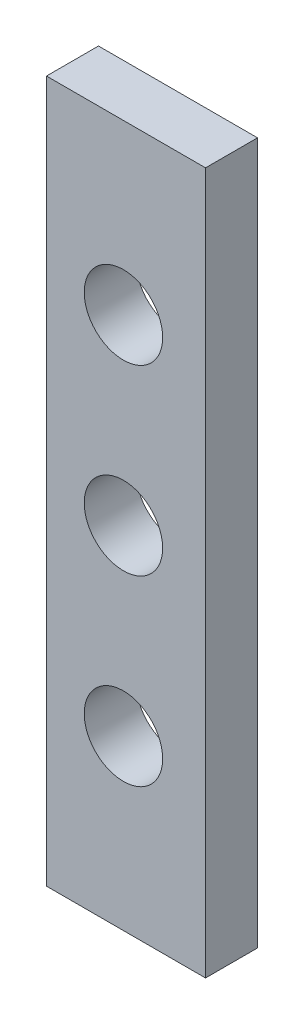
ISO-10303-21;
HEADER;
FILE_DESCRIPTION(('STEP AP214'),'2;1');
FILE_NAME('part.step','',(''),(''),'','','');
FILE_SCHEMA(('AUTOMOTIVE_DESIGN { 1 0 10303 214 1 1 1 1 }'));
ENDSEC;
DATA;
#1=APPLICATION_CONTEXT('core data for automotive mechanical design processes');
#2=APPLICATION_PROTOCOL_DEFINITION('international standard','automotive_design',2000,#1);
#3=PRODUCT_CONTEXT('',#1,'mechanical');
#4=PRODUCT('Part','Part','',(#3));
#5=PRODUCT_RELATED_PRODUCT_CATEGORY('part','',(#4));
#6=PRODUCT_DEFINITION_FORMATION('','',#4);
#7=PRODUCT_DEFINITION_CONTEXT('part definition',#1,'design');
#8=PRODUCT_DEFINITION('design','',#6,#7);
#9=PRODUCT_DEFINITION_SHAPE('','',#8);
#10=(LENGTH_UNIT() NAMED_UNIT(*) SI_UNIT(.MILLI.,.METRE.));
#11=(NAMED_UNIT(*) PLANE_ANGLE_UNIT() SI_UNIT($,.RADIAN.));
#12=(NAMED_UNIT(*) SI_UNIT($,.STERADIAN.) SOLID_ANGLE_UNIT());
#13=UNCERTAINTY_MEASURE_WITH_UNIT(LENGTH_MEASURE(1.E-05),#10,'distance_accuracy_value','');
#14=(GEOMETRIC_REPRESENTATION_CONTEXT(3) GLOBAL_UNCERTAINTY_ASSIGNED_CONTEXT((#13)) GLOBAL_UNIT_ASSIGNED_CONTEXT((#10,
#11,#12)) REPRESENTATION_CONTEXT('',''));
#15=CARTESIAN_POINT('',(0.,0.,0.));
#16=DIRECTION('',(0.,0.,1.));
#17=DIRECTION('',(1.,0.,0.));
#18=AXIS2_PLACEMENT_3D('',#15,#16,#17);
#19=CARTESIAN_POINT('',(-130.,-105.,42.4383510177094));
#20=DIRECTION('',(1.,0.,0.));
#21=DIRECTION('',(0.,0.,-1.));
#22=AXIS2_PLACEMENT_3D('',#19,#20,#21);
#23=PLANE('',#22);
#24=DIRECTION('',(0.,-1.,0.));
#25=VECTOR('',#24,1.);
#26=CARTESIAN_POINT('',(-130.,-105.,2.85000000128499));
#27=LINE('',#26,#25);
#28=CARTESIAN_POINT('',(-130.,-66.5373864405591,2.85000000128499));
#29=VERTEX_POINT('',#28);
#30=CARTESIAN_POINT('',(-130.,-105.,2.85000000128499));
#31=VERTEX_POINT('',#30);
#32=EDGE_CURVE('E89',#29,#31,#27,.T.);
#33=ORIENTED_EDGE('',*,*,#32,.F.);
#34=DIRECTION('',(0.,0.,-1.));
#35=VECTOR('',#34,1.);
#36=CARTESIAN_POINT('',(-130.,-66.5373864405591,42.4383510177094));
#37=LINE('',#36,#35);
#38=CARTESIAN_POINT('',(-130.,-66.5373864405591,0.));
#39=VERTEX_POINT('',#38);
#40=EDGE_CURVE('E55',#29,#39,#37,.T.);
#41=ORIENTED_EDGE('',*,*,#40,.T.);
#42=DIRECTION('',(0.,-1.,0.));
#43=VECTOR('',#42,1.);
#44=CARTESIAN_POINT('',(-130.,-105.,0.));
#45=LINE('',#44,#43);
#46=CARTESIAN_POINT('',(-130.,-105.,0.));
#47=VERTEX_POINT('',#46);
#48=EDGE_CURVE('E87',#39,#47,#45,.T.);
#49=ORIENTED_EDGE('',*,*,#48,.T.);
#50=DIRECTION('',(0.,0.,-1.));
#51=VECTOR('',#50,1.);
#52=CARTESIAN_POINT('',(-130.,-105.,42.4383510177094));
#53=LINE('',#52,#51);
#54=EDGE_CURVE('E78',#31,#47,#53,.T.);
#55=ORIENTED_EDGE('',*,*,#54,.F.);
#56=EDGE_LOOP('',(#33,#41,#49,#55));
#57=FACE_BOUND('',#56,.T.);
#58=ADVANCED_FACE('F38',(#57),#23,.F.);
#59=CARTESIAN_POINT('',(-130.,-105.,42.4383510177094));
#60=DIRECTION('',(0.,1.,0.));
#61=DIRECTION('',(-1.,0.,0.));
#62=AXIS2_PLACEMENT_3D('',#59,#60,#61);
#63=PLANE('',#62);
#64=DIRECTION('',(1.,0.,0.));
#65=VECTOR('',#64,1.);
#66=CARTESIAN_POINT('',(-130.,-105.,2.85000000128499));
#67=LINE('',#66,#65);
#68=CARTESIAN_POINT('',(-121.281577604188,-105.,2.85000000128499));
#69=VERTEX_POINT('',#68);
#70=EDGE_CURVE('E47',#31,#69,#67,.T.);
#71=ORIENTED_EDGE('',*,*,#70,.F.);
#72=ORIENTED_EDGE('',*,*,#54,.T.);
#73=DIRECTION('',(1.,0.,0.));
#74=VECTOR('',#73,1.);
#75=CARTESIAN_POINT('',(-130.,-105.,0.));
#76=LINE('',#75,#74);
#77=CARTESIAN_POINT('',(-121.281577604188,-105.,0.));
#78=VERTEX_POINT('',#77);
#79=EDGE_CURVE('E101',#47,#78,#76,.T.);
#80=ORIENTED_EDGE('',*,*,#79,.T.);
#81=DIRECTION('',(0.,0.,-1.));
#82=VECTOR('',#81,1.);
#83=CARTESIAN_POINT('',(-121.281577604188,-105.,42.4383510177094));
#84=LINE('',#83,#82);
#85=EDGE_CURVE('E110',#69,#78,#84,.T.);
#86=ORIENTED_EDGE('',*,*,#85,.F.);
#87=EDGE_LOOP('',(#71,#72,#80,#86));
#88=FACE_BOUND('',#87,.T.);
#89=ADVANCED_FACE('F133',(#88),#63,.F.);
#90=CARTESIAN_POINT('',(-121.281577604188,-105.,42.4383510177094));
#91=DIRECTION('',(-1.,0.,0.));
#92=DIRECTION('',(0.,-1.,0.));
#93=AXIS2_PLACEMENT_3D('',#90,#91,#92);
#94=PLANE('',#93);
#95=DIRECTION('',(0.,1.,0.));
#96=VECTOR('',#95,1.);
#97=CARTESIAN_POINT('',(-121.281577604188,-105.,2.85000000128499));
#98=LINE('',#97,#96);
#99=CARTESIAN_POINT('',(-121.281577604188,-66.5373864405591,2.85000000128499));
#100=VERTEX_POINT('',#99);
#101=EDGE_CURVE('E12',#69,#100,#98,.T.);
#102=ORIENTED_EDGE('',*,*,#101,.F.);
#103=ORIENTED_EDGE('',*,*,#85,.T.);
#104=DIRECTION('',(0.,1.,0.));
#105=VECTOR('',#104,1.);
#106=CARTESIAN_POINT('',(-121.281577604188,-105.,0.));
#107=LINE('',#106,#105);
#108=CARTESIAN_POINT('',(-121.281577604188,-66.5373864405591,0.));
#109=VERTEX_POINT('',#108);
#110=EDGE_CURVE('E112',#78,#109,#107,.T.);
#111=ORIENTED_EDGE('',*,*,#110,.T.);
#112=DIRECTION('',(0.,0.,-1.));
#113=VECTOR('',#112,1.);
#114=CARTESIAN_POINT('',(-121.281577604188,-66.5373864405591,42.4383510177094));
#115=LINE('',#114,#113);
#116=EDGE_CURVE('E61',#100,#109,#115,.T.);
#117=ORIENTED_EDGE('',*,*,#116,.F.);
#118=EDGE_LOOP('',(#102,#103,#111,#117));
#119=FACE_BOUND('',#118,.T.);
#120=ADVANCED_FACE('F132',(#119),#94,.F.);
#121=CARTESIAN_POINT('',(-130.,-66.5373864405591,42.4383510177094));
#122=DIRECTION('',(0.,-1.,0.));
#123=DIRECTION('',(0.,0.,-1.));
#124=AXIS2_PLACEMENT_3D('',#121,#122,#123);
#125=PLANE('',#124);
#126=DIRECTION('',(-1.,0.,0.));
#127=VECTOR('',#126,1.);
#128=CARTESIAN_POINT('',(-130.,-66.5373864405591,2.85000000128499));
#129=LINE('',#128,#127);
#130=EDGE_CURVE('E98',#100,#29,#129,.T.);
#131=ORIENTED_EDGE('',*,*,#130,.F.);
#132=ORIENTED_EDGE('',*,*,#116,.T.);
#133=DIRECTION('',(-1.,0.,0.));
#134=VECTOR('',#133,1.);
#135=CARTESIAN_POINT('',(-130.,-66.5373864405591,0.));
#136=LINE('',#135,#134);
#137=EDGE_CURVE('E94',#109,#39,#136,.T.);
#138=ORIENTED_EDGE('',*,*,#137,.T.);
#139=ORIENTED_EDGE('',*,*,#40,.F.);
#140=EDGE_LOOP('',(#131,#132,#138,#139));
#141=FACE_BOUND('',#140,.T.);
#142=ADVANCED_FACE('F95',(#141),#125,.F.);
#143=CARTESIAN_POINT('',(0.,0.,0.));
#144=DIRECTION('',(0.,0.,-1.));
#145=DIRECTION('',(-1.,0.,0.));
#146=AXIS2_PLACEMENT_3D('',#143,#144,#145);
#147=PLANE('',#146);
#148=CARTESIAN_POINT('',(-125.781577604187,-95.7686932202796,0.));
#149=DIRECTION('',(0.,0.,-1.));
#150=DIRECTION('',(-1.,0.,0.));
#151=AXIS2_PLACEMENT_3D('',#148,#149,#150);
#152=CIRCLE('',#151,2.15);
#153=CARTESIAN_POINT('',(-127.931577604187,-95.7686932202796,0.));
#154=VERTEX_POINT('',#153);
#155=EDGE_CURVE('E42',#154,#154,#152,.T.);
#156=ORIENTED_EDGE('',*,*,#155,.F.);
#157=EDGE_LOOP('',(#156));
#158=FACE_BOUND('',#157,.T.);
#159=CARTESIAN_POINT('',(-125.781577604187,-85.7686932202796,0.));
#160=DIRECTION('',(0.,0.,-1.));
#161=DIRECTION('',(-1.,0.,0.));
#162=AXIS2_PLACEMENT_3D('',#159,#160,#161);
#163=CIRCLE('',#162,2.15);
#164=CARTESIAN_POINT('',(-127.931577604187,-85.7686932202796,0.));
#165=VERTEX_POINT('',#164);
#166=EDGE_CURVE('E116',#165,#165,#163,.T.);
#167=ORIENTED_EDGE('',*,*,#166,.F.);
#168=EDGE_LOOP('',(#167));
#169=FACE_BOUND('',#168,.T.);
#170=CARTESIAN_POINT('',(-125.781577604187,-75.7686932202796,0.));
#171=DIRECTION('',(0.,0.,-1.));
#172=DIRECTION('',(-1.,0.,0.));
#173=AXIS2_PLACEMENT_3D('',#170,#171,#172);
#174=CIRCLE('',#173,2.15);
#175=CARTESIAN_POINT('',(-127.931577604187,-75.7686932202796,0.));
#176=VERTEX_POINT('',#175);
#177=EDGE_CURVE('E91',#176,#176,#174,.T.);
#178=ORIENTED_EDGE('',*,*,#177,.F.);
#179=EDGE_LOOP('',(#178));
#180=FACE_BOUND('',#179,.T.);
#181=ORIENTED_EDGE('',*,*,#48,.F.);
#182=ORIENTED_EDGE('',*,*,#137,.F.);
#183=ORIENTED_EDGE('',*,*,#110,.F.);
#184=ORIENTED_EDGE('',*,*,#79,.F.);
#185=EDGE_LOOP('',(#181,#182,#183,#184));
#186=FACE_BOUND('',#185,.T.);
#187=ADVANCED_FACE('F100',(#158,#169,#180,#186),#147,.T.);
#188=CARTESIAN_POINT('',(-98.0000000000002,121.642872631566,2.850000001285));
#189=DIRECTION('',(0.,0.,1.));
#190=DIRECTION('',(1.,0.,0.));
#191=AXIS2_PLACEMENT_3D('',#188,#189,#190);
#192=PLANE('',#191);
#193=CARTESIAN_POINT('',(-125.781577604187,-95.7686932202796,2.85000000128499));
#194=DIRECTION('',(0.,0.,1.));
#195=DIRECTION('',(1.,0.,0.));
#196=AXIS2_PLACEMENT_3D('',#193,#194,#195);
#197=CIRCLE('',#196,2.15);
#198=CARTESIAN_POINT('',(-123.631577604187,-95.7686932202796,2.85000000128499));
#199=VERTEX_POINT('',#198);
#200=EDGE_CURVE('E119',#199,#199,#197,.T.);
#201=ORIENTED_EDGE('',*,*,#200,.F.);
#202=EDGE_LOOP('',(#201));
#203=FACE_BOUND('',#202,.T.);
#204=CARTESIAN_POINT('',(-125.781577604187,-85.7686932202796,2.85000000128499));
#205=DIRECTION('',(0.,0.,1.));
#206=DIRECTION('',(1.,0.,0.));
#207=AXIS2_PLACEMENT_3D('',#204,#205,#206);
#208=CIRCLE('',#207,2.15);
#209=CARTESIAN_POINT('',(-123.631577604187,-85.7686932202796,2.85000000128499));
#210=VERTEX_POINT('',#209);
#211=EDGE_CURVE('E117',#210,#210,#208,.T.);
#212=ORIENTED_EDGE('',*,*,#211,.F.);
#213=EDGE_LOOP('',(#212));
#214=FACE_BOUND('',#213,.T.);
#215=CARTESIAN_POINT('',(-125.781577604187,-75.7686932202796,2.85000000128499));
#216=DIRECTION('',(0.,0.,1.));
#217=DIRECTION('',(1.,0.,0.));
#218=AXIS2_PLACEMENT_3D('',#215,#216,#217);
#219=CIRCLE('',#218,2.15);
#220=CARTESIAN_POINT('',(-123.631577604187,-75.7686932202796,2.85000000128499));
#221=VERTEX_POINT('',#220);
#222=EDGE_CURVE('E114',#221,#221,#219,.T.);
#223=ORIENTED_EDGE('',*,*,#222,.F.);
#224=EDGE_LOOP('',(#223));
#225=FACE_BOUND('',#224,.T.);
#226=ORIENTED_EDGE('',*,*,#130,.T.);
#227=ORIENTED_EDGE('',*,*,#32,.T.);
#228=ORIENTED_EDGE('',*,*,#70,.T.);
#229=ORIENTED_EDGE('',*,*,#101,.T.);
#230=EDGE_LOOP('',(#226,#227,#228,#229));
#231=FACE_BOUND('',#230,.T.);
#232=ADVANCED_FACE('F40',(#203,#214,#225,#231),#192,.T.);
#233=CARTESIAN_POINT('',(-125.781577604187,-75.7686932202796,7.00000000128501));
#234=DIRECTION('',(0.,0.,1.));
#235=DIRECTION('',(1.,0.,0.));
#236=AXIS2_PLACEMENT_3D('',#233,#234,#235);
#237=CYLINDRICAL_SURFACE('',#236,2.15);
#238=ORIENTED_EDGE('',*,*,#177,.T.);
#239=EDGE_LOOP('',(#238));
#240=FACE_BOUND('',#239,.T.);
#241=ORIENTED_EDGE('',*,*,#222,.T.);
#242=EDGE_LOOP('',(#241));
#243=FACE_BOUND('',#242,.T.);
#244=ADVANCED_FACE('F147',(#240,#243),#237,.F.);
#245=CARTESIAN_POINT('',(-125.781577604187,-85.7686932202796,7.00000000128501));
#246=DIRECTION('',(0.,0.,1.));
#247=DIRECTION('',(1.,0.,0.));
#248=AXIS2_PLACEMENT_3D('',#245,#246,#247);
#249=CYLINDRICAL_SURFACE('',#248,2.15);
#250=ORIENTED_EDGE('',*,*,#166,.T.);
#251=EDGE_LOOP('',(#250));
#252=FACE_BOUND('',#251,.T.);
#253=ORIENTED_EDGE('',*,*,#211,.T.);
#254=EDGE_LOOP('',(#253));
#255=FACE_BOUND('',#254,.T.);
#256=ADVANCED_FACE('F150',(#252,#255),#249,.F.);
#257=CARTESIAN_POINT('',(-125.781577604187,-95.7686932202796,7.00000000128501));
#258=DIRECTION('',(0.,0.,1.));
#259=DIRECTION('',(1.,0.,0.));
#260=AXIS2_PLACEMENT_3D('',#257,#258,#259);
#261=CYLINDRICAL_SURFACE('',#260,2.15);
#262=ORIENTED_EDGE('',*,*,#200,.T.);
#263=EDGE_LOOP('',(#262));
#264=FACE_BOUND('',#263,.T.);
#265=ORIENTED_EDGE('',*,*,#155,.T.);
#266=EDGE_LOOP('',(#265));
#267=FACE_BOUND('',#266,.T.);
#268=ADVANCED_FACE('F154',(#264,#267),#261,.F.);
#269=CLOSED_SHELL('',(#58,#89,#120,#142,#187,#232,#244,#256,#268));
#270=MANIFOLD_SOLID_BREP('B2',#269);
#271=ADVANCED_BREP_SHAPE_REPRESENTATION('',(#18,#270),#14);
#272=SHAPE_DEFINITION_REPRESENTATION(#9,#271);
ENDSEC;
END-ISO-10303-21;
